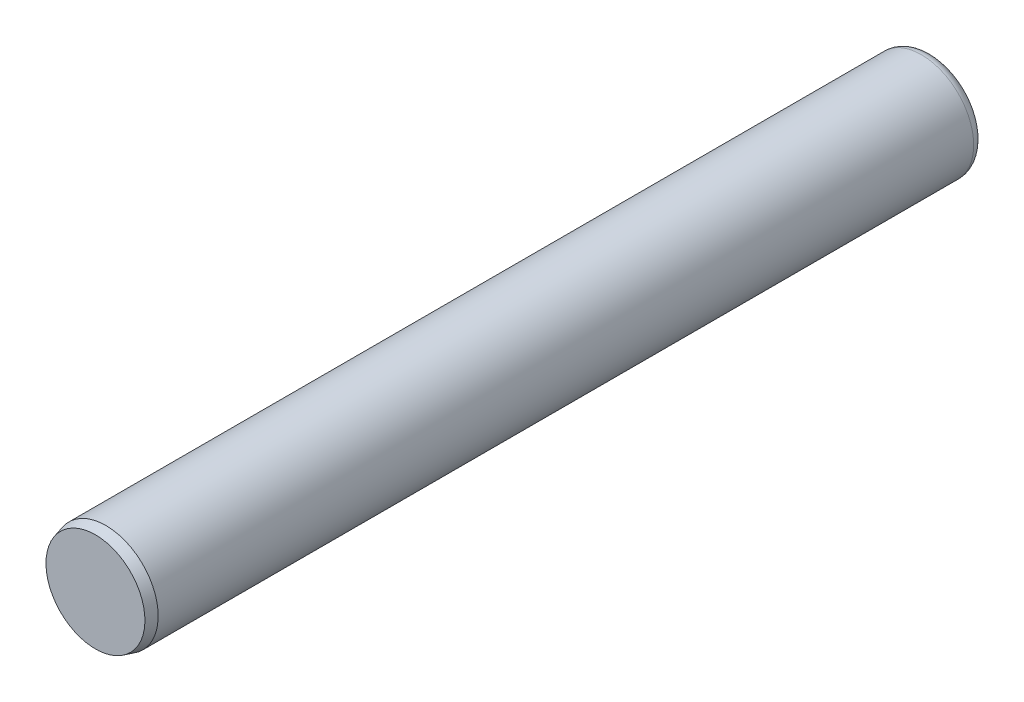
ISO-10303-21;
HEADER;
FILE_DESCRIPTION(('STEP AP214'),'2;1');
FILE_NAME('part.step','',(''),(''),'','','');
FILE_SCHEMA(('AUTOMOTIVE_DESIGN { 1 0 10303 214 1 1 1 1 }'));
ENDSEC;
DATA;
#1=APPLICATION_CONTEXT('core data for automotive mechanical design processes');
#2=APPLICATION_PROTOCOL_DEFINITION('international standard','automotive_design',2000,#1);
#3=PRODUCT_CONTEXT('',#1,'mechanical');
#4=PRODUCT('Part','Part','',(#3));
#5=PRODUCT_RELATED_PRODUCT_CATEGORY('part','',(#4));
#6=PRODUCT_DEFINITION_FORMATION('','',#4);
#7=PRODUCT_DEFINITION_CONTEXT('part definition',#1,'design');
#8=PRODUCT_DEFINITION('design','',#6,#7);
#9=PRODUCT_DEFINITION_SHAPE('','',#8);
#10=(LENGTH_UNIT() NAMED_UNIT(*) SI_UNIT(.MILLI.,.METRE.));
#11=(NAMED_UNIT(*) PLANE_ANGLE_UNIT() SI_UNIT($,.RADIAN.));
#12=(NAMED_UNIT(*) SI_UNIT($,.STERADIAN.) SOLID_ANGLE_UNIT());
#13=UNCERTAINTY_MEASURE_WITH_UNIT(LENGTH_MEASURE(1.E-05),#10,'distance_accuracy_value','');
#14=(GEOMETRIC_REPRESENTATION_CONTEXT(3) GLOBAL_UNCERTAINTY_ASSIGNED_CONTEXT((#13)) GLOBAL_UNIT_ASSIGNED_CONTEXT((#10,
#11,#12)) REPRESENTATION_CONTEXT('',''));
#15=CARTESIAN_POINT('',(0.,0.,0.));
#16=DIRECTION('',(0.,0.,1.));
#17=DIRECTION('',(1.,0.,0.));
#18=AXIS2_PLACEMENT_3D('',#15,#16,#17);
#19=CARTESIAN_POINT('',(0.,0.,6.35));
#20=DIRECTION('',(0.,0.,1.));
#21=DIRECTION('',(0.,-1.,0.));
#22=AXIS2_PLACEMENT_3D('',#19,#20,#21);
#23=PLANE('',#22);
#24=CARTESIAN_POINT('',(0.,0.,6.35));
#25=DIRECTION('',(0.,0.,-1.));
#26=DIRECTION('',(0.,1.,0.));
#27=AXIS2_PLACEMENT_3D('',#24,#25,#26);
#28=CIRCLE('',#27,0.75121306570156);
#29=CARTESIAN_POINT('',(0.,0.75121306570156,6.35));
#30=VERTEX_POINT('',#29);
#31=EDGE_CURVE('E10',#30,#30,#28,.T.);
#32=ORIENTED_EDGE('',*,*,#31,.F.);
#33=EDGE_LOOP('',(#32));
#34=FACE_BOUND('',#33,.T.);
#35=ADVANCED_FACE('F41',(#34),#23,.T.);
#36=CARTESIAN_POINT('',(0.,0.,6.19125));
#37=DIRECTION('',(0.,0.,-1.));
#38=DIRECTION('',(0.,1.,0.));
#39=AXIS2_PLACEMENT_3D('',#36,#37,#38);
#40=CONICAL_SURFACE('',#39,0.79375,0.261799387799149);
#41=ORIENTED_EDGE('',*,*,#31,.T.);
#42=EDGE_LOOP('',(#41));
#43=FACE_BOUND('',#42,.T.);
#44=CARTESIAN_POINT('',(0.,0.,6.19125));
#45=DIRECTION('',(0.,0.,-1.));
#46=DIRECTION('',(0.,1.,0.));
#47=AXIS2_PLACEMENT_3D('',#44,#45,#46);
#48=CIRCLE('',#47,0.79375);
#49=CARTESIAN_POINT('',(0.,0.79375,6.19125));
#50=VERTEX_POINT('',#49);
#51=EDGE_CURVE('E48',#50,#50,#48,.T.);
#52=ORIENTED_EDGE('',*,*,#51,.F.);
#53=EDGE_LOOP('',(#52));
#54=FACE_BOUND('',#53,.T.);
#55=ADVANCED_FACE('F77',(#43,#54),#40,.T.);
#56=CARTESIAN_POINT('',(0.,0.,-6.35));
#57=DIRECTION('',(0.,0.,-1.));
#58=DIRECTION('',(0.,1.,0.));
#59=AXIS2_PLACEMENT_3D('',#56,#57,#58);
#60=CYLINDRICAL_SURFACE('',#59,0.793749999999999);
#61=ORIENTED_EDGE('',*,*,#51,.T.);
#62=EDGE_LOOP('',(#61));
#63=FACE_BOUND('',#62,.T.);
#64=CARTESIAN_POINT('',(0.,0.,-6.19125));
#65=DIRECTION('',(0.,0.,-1.));
#66=DIRECTION('',(0.,1.,0.));
#67=AXIS2_PLACEMENT_3D('',#64,#65,#66);
#68=CIRCLE('',#67,0.793749999999998);
#69=CARTESIAN_POINT('',(0.,0.79375,-6.19125));
#70=VERTEX_POINT('',#69);
#71=EDGE_CURVE('E53',#70,#70,#68,.T.);
#72=ORIENTED_EDGE('',*,*,#71,.F.);
#73=EDGE_LOOP('',(#72));
#74=FACE_BOUND('',#73,.T.);
#75=ADVANCED_FACE('F69',(#63,#74),#60,.T.);
#76=CARTESIAN_POINT('',(0.,0.,-6.19125));
#77=DIRECTION('',(0.,0.,-1.));
#78=DIRECTION('',(0.,1.,0.));
#79=AXIS2_PLACEMENT_3D('',#76,#77,#78);
#80=TOROIDAL_SURFACE('',#79,0.634999999999998,0.15875);
#81=ORIENTED_EDGE('',*,*,#71,.T.);
#82=EDGE_LOOP('',(#81));
#83=FACE_BOUND('',#82,.T.);
#84=CARTESIAN_POINT('',(0.,0.,-6.35));
#85=DIRECTION('',(0.,0.,-1.));
#86=DIRECTION('',(0.,1.,0.));
#87=AXIS2_PLACEMENT_3D('',#84,#85,#86);
#88=CIRCLE('',#87,0.634999999999998);
#89=CARTESIAN_POINT('',(0.,0.635,-6.35));
#90=VERTEX_POINT('',#89);
#91=EDGE_CURVE('E58',#90,#90,#88,.T.);
#92=ORIENTED_EDGE('',*,*,#91,.F.);
#93=EDGE_LOOP('',(#92));
#94=FACE_BOUND('',#93,.T.);
#95=ADVANCED_FACE('F67',(#83,#94),#80,.T.);
#96=CARTESIAN_POINT('',(0.,0.635,-6.35));
#97=DIRECTION('',(0.,0.,-1.));
#98=DIRECTION('',(0.,1.,0.));
#99=AXIS2_PLACEMENT_3D('',#96,#97,#98);
#100=PLANE('',#99);
#101=ORIENTED_EDGE('',*,*,#91,.T.);
#102=EDGE_LOOP('',(#101));
#103=FACE_BOUND('',#102,.T.);
#104=ADVANCED_FACE('F65',(#103),#100,.T.);
#105=CLOSED_SHELL('',(#35,#55,#75,#95,#104));
#106=MANIFOLD_SOLID_BREP('B2',#105);
#107=ADVANCED_BREP_SHAPE_REPRESENTATION('',(#18,#106),#14);
#108=SHAPE_DEFINITION_REPRESENTATION(#9,#107);
ENDSEC;
END-ISO-10303-21;
